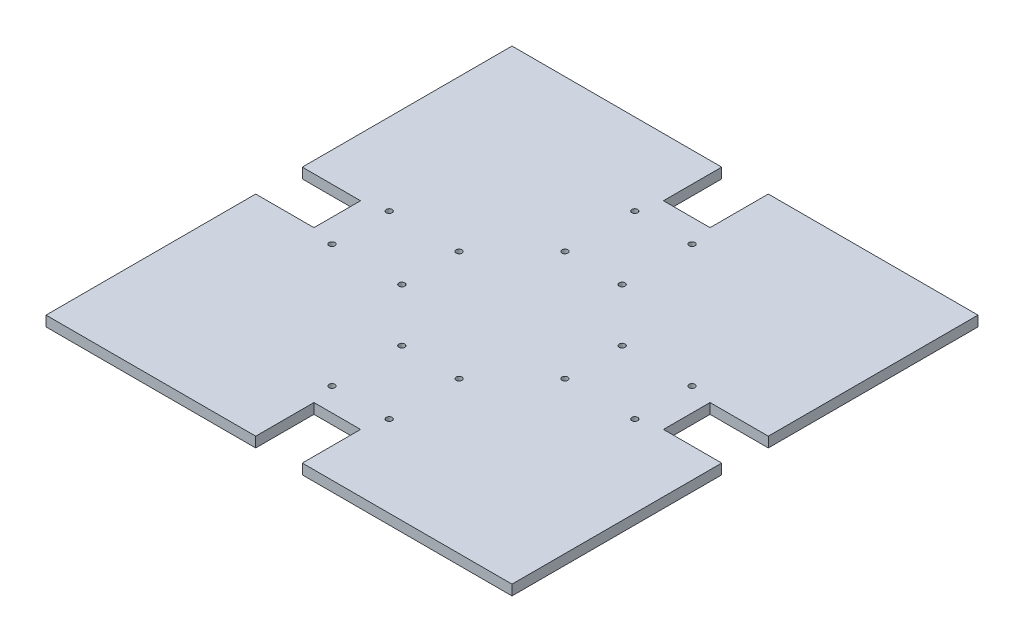
ISO-10303-21;
HEADER;
FILE_DESCRIPTION(('STEP AP214'),'2;1');
FILE_NAME('part.step','',(''),(''),'','','');
FILE_SCHEMA(('AUTOMOTIVE_DESIGN { 1 0 10303 214 1 1 1 1 }'));
ENDSEC;
DATA;
#1=APPLICATION_CONTEXT('core data for automotive mechanical design processes');
#2=APPLICATION_PROTOCOL_DEFINITION('international standard','automotive_design',2000,#1);
#3=PRODUCT_CONTEXT('',#1,'mechanical');
#4=PRODUCT('Part','Part','',(#3));
#5=PRODUCT_RELATED_PRODUCT_CATEGORY('part','',(#4));
#6=PRODUCT_DEFINITION_FORMATION('','',#4);
#7=PRODUCT_DEFINITION_CONTEXT('part definition',#1,'design');
#8=PRODUCT_DEFINITION('design','',#6,#7);
#9=PRODUCT_DEFINITION_SHAPE('','',#8);
#10=(LENGTH_UNIT() NAMED_UNIT(*) SI_UNIT(.MILLI.,.METRE.));
#11=(NAMED_UNIT(*) PLANE_ANGLE_UNIT() SI_UNIT($,.RADIAN.));
#12=(NAMED_UNIT(*) SI_UNIT($,.STERADIAN.) SOLID_ANGLE_UNIT());
#13=UNCERTAINTY_MEASURE_WITH_UNIT(LENGTH_MEASURE(1.E-05),#10,'distance_accuracy_value','');
#14=(GEOMETRIC_REPRESENTATION_CONTEXT(3) GLOBAL_UNCERTAINTY_ASSIGNED_CONTEXT((#13)) GLOBAL_UNIT_ASSIGNED_CONTEXT((#10,
#11,#12)) REPRESENTATION_CONTEXT('',''));
#15=CARTESIAN_POINT('',(0.,0.,0.));
#16=DIRECTION('',(0.,0.,1.));
#17=DIRECTION('',(1.,0.,0.));
#18=AXIS2_PLACEMENT_3D('',#15,#16,#17);
#19=CARTESIAN_POINT('',(127.,5.588,-127.));
#20=DIRECTION('',(-1.,0.,0.));
#21=DIRECTION('',(0.,0.,1.));
#22=AXIS2_PLACEMENT_3D('',#19,#20,#21);
#23=PLANE('',#22);
#24=DIRECTION('',(0.,0.,-1.));
#25=VECTOR('',#24,1.);
#26=CARTESIAN_POINT('',(127.,0.,-127.));
#27=LINE('',#26,#25);
#28=CARTESIAN_POINT('',(127.,0.,127.));
#29=VERTEX_POINT('',#28);
#30=CARTESIAN_POINT('',(127.,0.,12.7));
#31=VERTEX_POINT('',#30);
#32=EDGE_CURVE('E204',#29,#31,#27,.T.);
#33=ORIENTED_EDGE('',*,*,#32,.T.);
#34=DIRECTION('',(0.,1.,0.));
#35=VECTOR('',#34,1.);
#36=CARTESIAN_POINT('',(127.,0.,12.7));
#37=LINE('',#36,#35);
#38=CARTESIAN_POINT('',(127.,5.588,12.7));
#39=VERTEX_POINT('',#38);
#40=EDGE_CURVE('E385',#31,#39,#37,.T.);
#41=ORIENTED_EDGE('',*,*,#40,.T.);
#42=DIRECTION('',(0.,0.,-1.));
#43=VECTOR('',#42,1.);
#44=CARTESIAN_POINT('',(127.,5.588,-127.));
#45=LINE('',#44,#43);
#46=CARTESIAN_POINT('',(127.,5.588,127.));
#47=VERTEX_POINT('',#46);
#48=EDGE_CURVE('E356',#47,#39,#45,.T.);
#49=ORIENTED_EDGE('',*,*,#48,.F.);
#50=DIRECTION('',(0.,-1.,0.));
#51=VECTOR('',#50,1.);
#52=CARTESIAN_POINT('',(127.,5.588,127.));
#53=LINE('',#52,#51);
#54=EDGE_CURVE('E214',#47,#29,#53,.T.);
#55=ORIENTED_EDGE('',*,*,#54,.T.);
#56=EDGE_LOOP('',(#33,#41,#49,#55));
#57=FACE_BOUND('',#56,.T.);
#58=ADVANCED_FACE('F35',(#57),#23,.F.);
#59=CARTESIAN_POINT('',(-127.,5.588,-127.));
#60=DIRECTION('',(0.,0.,1.));
#61=DIRECTION('',(1.,0.,0.));
#62=AXIS2_PLACEMENT_3D('',#59,#60,#61);
#63=PLANE('',#62);
#64=DIRECTION('',(-1.,0.,0.));
#65=VECTOR('',#64,1.);
#66=CARTESIAN_POINT('',(-127.,0.,-127.));
#67=LINE('',#66,#65);
#68=CARTESIAN_POINT('',(127.,0.,-127.));
#69=VERTEX_POINT('',#68);
#70=CARTESIAN_POINT('',(12.7,0.,-127.));
#71=VERTEX_POINT('',#70);
#72=EDGE_CURVE('E192',#69,#71,#67,.T.);
#73=ORIENTED_EDGE('',*,*,#72,.T.);
#74=DIRECTION('',(0.,1.,0.));
#75=VECTOR('',#74,1.);
#76=CARTESIAN_POINT('',(12.7,0.,-127.));
#77=LINE('',#76,#75);
#78=CARTESIAN_POINT('',(12.7,5.588,-127.));
#79=VERTEX_POINT('',#78);
#80=EDGE_CURVE('E172',#71,#79,#77,.T.);
#81=ORIENTED_EDGE('',*,*,#80,.T.);
#82=DIRECTION('',(-1.,0.,0.));
#83=VECTOR('',#82,1.);
#84=CARTESIAN_POINT('',(-127.,5.588,-127.));
#85=LINE('',#84,#83);
#86=CARTESIAN_POINT('',(127.,5.588,-127.));
#87=VERTEX_POINT('',#86);
#88=EDGE_CURVE('E360',#87,#79,#85,.T.);
#89=ORIENTED_EDGE('',*,*,#88,.F.);
#90=DIRECTION('',(0.,-1.,0.));
#91=VECTOR('',#90,1.);
#92=CARTESIAN_POINT('',(127.,5.588,-127.));
#93=LINE('',#92,#91);
#94=EDGE_CURVE('E11',#87,#69,#93,.T.);
#95=ORIENTED_EDGE('',*,*,#94,.T.);
#96=EDGE_LOOP('',(#73,#81,#89,#95));
#97=FACE_BOUND('',#96,.T.);
#98=ADVANCED_FACE('F197',(#97),#63,.F.);
#99=CARTESIAN_POINT('',(-127.,5.588,-127.));
#100=DIRECTION('',(1.,0.,0.));
#101=DIRECTION('',(0.,0.,-1.));
#102=AXIS2_PLACEMENT_3D('',#99,#100,#101);
#103=PLANE('',#102);
#104=DIRECTION('',(0.,0.,1.));
#105=VECTOR('',#104,1.);
#106=CARTESIAN_POINT('',(-127.,5.588,-127.));
#107=LINE('',#106,#105);
#108=CARTESIAN_POINT('',(-127.,5.588,12.7));
#109=VERTEX_POINT('',#108);
#110=CARTESIAN_POINT('',(-127.,5.588,127.));
#111=VERTEX_POINT('',#110);
#112=EDGE_CURVE('E362',#109,#111,#107,.T.);
#113=ORIENTED_EDGE('',*,*,#112,.F.);
#114=DIRECTION('',(0.,1.,0.));
#115=VECTOR('',#114,1.);
#116=CARTESIAN_POINT('',(-127.,0.,12.7));
#117=LINE('',#116,#115);
#118=CARTESIAN_POINT('',(-127.,0.,12.7));
#119=VERTEX_POINT('',#118);
#120=EDGE_CURVE('E259',#119,#109,#117,.T.);
#121=ORIENTED_EDGE('',*,*,#120,.F.);
#122=DIRECTION('',(0.,0.,1.));
#123=VECTOR('',#122,1.);
#124=CARTESIAN_POINT('',(-127.,0.,-127.));
#125=LINE('',#124,#123);
#126=CARTESIAN_POINT('',(-127.,0.,127.));
#127=VERTEX_POINT('',#126);
#128=EDGE_CURVE('E199',#119,#127,#125,.T.);
#129=ORIENTED_EDGE('',*,*,#128,.T.);
#130=DIRECTION('',(0.,-1.,0.));
#131=VECTOR('',#130,1.);
#132=CARTESIAN_POINT('',(-127.,5.588,127.));
#133=LINE('',#132,#131);
#134=EDGE_CURVE('E217',#111,#127,#133,.T.);
#135=ORIENTED_EDGE('',*,*,#134,.F.);
#136=EDGE_LOOP('',(#113,#121,#129,#135));
#137=FACE_BOUND('',#136,.T.);
#138=ADVANCED_FACE('F476',(#137),#103,.F.);
#139=CARTESIAN_POINT('',(-127.,5.588,127.));
#140=DIRECTION('',(0.,0.,-1.));
#141=DIRECTION('',(-1.,0.,0.));
#142=AXIS2_PLACEMENT_3D('',#139,#140,#141);
#143=PLANE('',#142);
#144=DIRECTION('',(1.,0.,0.));
#145=VECTOR('',#144,1.);
#146=CARTESIAN_POINT('',(-127.,5.588,127.));
#147=LINE('',#146,#145);
#148=CARTESIAN_POINT('',(12.7,5.588,127.));
#149=VERTEX_POINT('',#148);
#150=EDGE_CURVE('E363',#149,#47,#147,.T.);
#151=ORIENTED_EDGE('',*,*,#150,.F.);
#152=DIRECTION('',(0.,1.,0.));
#153=VECTOR('',#152,1.);
#154=CARTESIAN_POINT('',(12.7,0.,127.));
#155=LINE('',#154,#153);
#156=CARTESIAN_POINT('',(12.7,0.,127.));
#157=VERTEX_POINT('',#156);
#158=EDGE_CURVE('E417',#157,#149,#155,.T.);
#159=ORIENTED_EDGE('',*,*,#158,.F.);
#160=DIRECTION('',(1.,0.,0.));
#161=VECTOR('',#160,1.);
#162=CARTESIAN_POINT('',(-127.,0.,127.));
#163=LINE('',#162,#161);
#164=EDGE_CURVE('E209',#157,#29,#163,.T.);
#165=ORIENTED_EDGE('',*,*,#164,.T.);
#166=ORIENTED_EDGE('',*,*,#54,.F.);
#167=EDGE_LOOP('',(#151,#159,#165,#166));
#168=FACE_BOUND('',#167,.T.);
#169=ADVANCED_FACE('F380',(#168),#143,.F.);
#170=CARTESIAN_POINT('',(127.,5.588,-12.7));
#171=VERTEX_POINT('',#170);
#172=EDGE_CURVE('E213',#171,#87,#45,.T.);
#173=ORIENTED_EDGE('',*,*,#172,.F.);
#174=DIRECTION('',(0.,1.,0.));
#175=VECTOR('',#174,1.);
#176=CARTESIAN_POINT('',(127.,0.,-12.7));
#177=LINE('',#176,#175);
#178=CARTESIAN_POINT('',(127.,0.,-12.7));
#179=VERTEX_POINT('',#178);
#180=EDGE_CURVE('E400',#179,#171,#177,.T.);
#181=ORIENTED_EDGE('',*,*,#180,.F.);
#182=EDGE_CURVE('E353',#179,#69,#27,.T.);
#183=ORIENTED_EDGE('',*,*,#182,.T.);
#184=ORIENTED_EDGE('',*,*,#94,.F.);
#185=EDGE_LOOP('',(#173,#181,#183,#184));
#186=FACE_BOUND('',#185,.T.);
#187=ADVANCED_FACE('F37',(#186),#23,.F.);
#188=CARTESIAN_POINT('',(-12.7,5.588,-127.));
#189=VERTEX_POINT('',#188);
#190=CARTESIAN_POINT('',(-127.,5.588,-127.));
#191=VERTEX_POINT('',#190);
#192=EDGE_CURVE('E359',#189,#191,#85,.T.);
#193=ORIENTED_EDGE('',*,*,#192,.F.);
#194=DIRECTION('',(0.,1.,0.));
#195=VECTOR('',#194,1.);
#196=CARTESIAN_POINT('',(-12.7,0.,-127.));
#197=LINE('',#196,#195);
#198=CARTESIAN_POINT('',(-12.7,0.,-127.));
#199=VERTEX_POINT('',#198);
#200=EDGE_CURVE('E183',#199,#189,#197,.T.);
#201=ORIENTED_EDGE('',*,*,#200,.F.);
#202=CARTESIAN_POINT('',(-127.,0.,-127.));
#203=VERTEX_POINT('',#202);
#204=EDGE_CURVE('E200',#199,#203,#67,.T.);
#205=ORIENTED_EDGE('',*,*,#204,.T.);
#206=DIRECTION('',(0.,-1.,0.));
#207=VECTOR('',#206,1.);
#208=CARTESIAN_POINT('',(-127.,5.588,-127.));
#209=LINE('',#208,#207);
#210=EDGE_CURVE('E43',#191,#203,#209,.T.);
#211=ORIENTED_EDGE('',*,*,#210,.F.);
#212=EDGE_LOOP('',(#193,#201,#205,#211));
#213=FACE_BOUND('',#212,.T.);
#214=ADVANCED_FACE('F477',(#213),#63,.F.);
#215=CARTESIAN_POINT('',(-127.,0.,-12.7));
#216=VERTEX_POINT('',#215);
#217=EDGE_CURVE('E202',#203,#216,#125,.T.);
#218=ORIENTED_EDGE('',*,*,#217,.T.);
#219=DIRECTION('',(0.,1.,0.));
#220=VECTOR('',#219,1.);
#221=CARTESIAN_POINT('',(-127.,0.,-12.7));
#222=LINE('',#221,#220);
#223=CARTESIAN_POINT('',(-127.,5.588,-12.7));
#224=VERTEX_POINT('',#223);
#225=EDGE_CURVE('E261',#216,#224,#222,.T.);
#226=ORIENTED_EDGE('',*,*,#225,.T.);
#227=EDGE_CURVE('E228',#191,#224,#107,.T.);
#228=ORIENTED_EDGE('',*,*,#227,.F.);
#229=ORIENTED_EDGE('',*,*,#210,.T.);
#230=EDGE_LOOP('',(#218,#226,#228,#229));
#231=FACE_BOUND('',#230,.T.);
#232=ADVANCED_FACE('F225',(#231),#103,.F.);
#233=CARTESIAN_POINT('',(-12.7,0.,127.));
#234=VERTEX_POINT('',#233);
#235=EDGE_CURVE('E210',#127,#234,#163,.T.);
#236=ORIENTED_EDGE('',*,*,#235,.T.);
#237=DIRECTION('',(0.,1.,0.));
#238=VECTOR('',#237,1.);
#239=CARTESIAN_POINT('',(-12.7,0.,127.));
#240=LINE('',#239,#238);
#241=CARTESIAN_POINT('',(-12.7,5.588,127.));
#242=VERTEX_POINT('',#241);
#243=EDGE_CURVE('E420',#234,#242,#240,.T.);
#244=ORIENTED_EDGE('',*,*,#243,.T.);
#245=EDGE_CURVE('E218',#111,#242,#147,.T.);
#246=ORIENTED_EDGE('',*,*,#245,.F.);
#247=ORIENTED_EDGE('',*,*,#134,.T.);
#248=EDGE_LOOP('',(#236,#244,#246,#247));
#249=FACE_BOUND('',#248,.T.);
#250=ADVANCED_FACE('F433',(#249),#143,.F.);
#251=CARTESIAN_POINT('',(0.,5.588,0.));
#252=DIRECTION('',(0.,1.,0.));
#253=DIRECTION('',(0.,0.,1.));
#254=AXIS2_PLACEMENT_3D('',#251,#252,#253);
#255=PLANE('',#254);
#256=CARTESIAN_POINT('',(82.5500000000001,5.588,-15.6));
#257=DIRECTION('',(0.,1.,0.));
#258=DIRECTION('',(0.,0.,1.));
#259=AXIS2_PLACEMENT_3D('',#256,#257,#258);
#260=CIRCLE('',#259,1.60000000000002);
#261=CARTESIAN_POINT('',(82.5500000000001,5.588,-14.));
#262=VERTEX_POINT('',#261);
#263=EDGE_CURVE('E268',#262,#262,#260,.T.);
#264=ORIENTED_EDGE('',*,*,#263,.F.);
#265=EDGE_LOOP('',(#264));
#266=FACE_BOUND('',#265,.T.);
#267=CARTESIAN_POINT('',(82.5500000000001,5.588,15.6));
#268=DIRECTION('',(0.,1.,0.));
#269=DIRECTION('',(0.,0.,1.));
#270=AXIS2_PLACEMENT_3D('',#267,#268,#269);
#271=CIRCLE('',#270,1.60000000000002);
#272=CARTESIAN_POINT('',(82.5500000000001,5.588,17.2));
#273=VERTEX_POINT('',#272);
#274=EDGE_CURVE('E274',#273,#273,#271,.T.);
#275=ORIENTED_EDGE('',*,*,#274,.F.);
#276=EDGE_LOOP('',(#275));
#277=FACE_BOUND('',#276,.T.);
#278=CARTESIAN_POINT('',(-15.6,5.588,-44.45));
#279=DIRECTION('',(0.,1.,0.));
#280=DIRECTION('',(0.,0.,1.));
#281=AXIS2_PLACEMENT_3D('',#278,#279,#280);
#282=CIRCLE('',#281,1.6);
#283=CARTESIAN_POINT('',(-15.6,5.588,-42.85));
#284=VERTEX_POINT('',#283);
#285=EDGE_CURVE('E280',#284,#284,#282,.T.);
#286=ORIENTED_EDGE('',*,*,#285,.F.);
#287=EDGE_LOOP('',(#286));
#288=FACE_BOUND('',#287,.T.);
#289=CARTESIAN_POINT('',(-15.6,5.588,-82.55));
#290=DIRECTION('',(0.,1.,0.));
#291=DIRECTION('',(0.,0.,1.));
#292=AXIS2_PLACEMENT_3D('',#289,#290,#291);
#293=CIRCLE('',#292,1.6);
#294=CARTESIAN_POINT('',(-15.6,5.588,-80.95));
#295=VERTEX_POINT('',#294);
#296=EDGE_CURVE('E286',#295,#295,#293,.T.);
#297=ORIENTED_EDGE('',*,*,#296,.F.);
#298=EDGE_LOOP('',(#297));
#299=FACE_BOUND('',#298,.T.);
#300=CARTESIAN_POINT('',(15.6,5.588,-82.55));
#301=DIRECTION('',(0.,1.,0.));
#302=DIRECTION('',(0.,0.,1.));
#303=AXIS2_PLACEMENT_3D('',#300,#301,#302);
#304=CIRCLE('',#303,1.60000000000001);
#305=CARTESIAN_POINT('',(15.6,5.588,-80.95));
#306=VERTEX_POINT('',#305);
#307=EDGE_CURVE('E292',#306,#306,#304,.T.);
#308=ORIENTED_EDGE('',*,*,#307,.F.);
#309=EDGE_LOOP('',(#308));
#310=FACE_BOUND('',#309,.T.);
#311=DIRECTION('',(0.,0.,-1.));
#312=VECTOR('',#311,1.);
#313=CARTESIAN_POINT('',(12.7,5.588,127.));
#314=LINE('',#313,#312);
#315=CARTESIAN_POINT('',(12.7,5.588,95.25));
#316=VERTEX_POINT('',#315);
#317=EDGE_CURVE('E377',#149,#316,#314,.T.);
#318=ORIENTED_EDGE('',*,*,#317,.F.);
#319=ORIENTED_EDGE('',*,*,#150,.T.);
#320=ORIENTED_EDGE('',*,*,#48,.T.);
#321=DIRECTION('',(1.,0.,0.));
#322=VECTOR('',#321,1.);
#323=CARTESIAN_POINT('',(95.2500000000001,5.588,12.7));
#324=LINE('',#323,#322);
#325=CARTESIAN_POINT('',(95.2500000000001,5.588,12.7));
#326=VERTEX_POINT('',#325);
#327=EDGE_CURVE('E396',#326,#39,#324,.T.);
#328=ORIENTED_EDGE('',*,*,#327,.F.);
#329=DIRECTION('',(0.,0.,1.));
#330=VECTOR('',#329,1.);
#331=CARTESIAN_POINT('',(95.2500000000001,5.588,12.7));
#332=LINE('',#331,#330);
#333=CARTESIAN_POINT('',(95.2500000000001,5.588,-12.7));
#334=VERTEX_POINT('',#333);
#335=EDGE_CURVE('E491',#334,#326,#332,.T.);
#336=ORIENTED_EDGE('',*,*,#335,.F.);
#337=DIRECTION('',(-1.,0.,0.));
#338=VECTOR('',#337,1.);
#339=CARTESIAN_POINT('',(95.2500000000001,5.588,-12.7));
#340=LINE('',#339,#338);
#341=EDGE_CURVE('E419',#171,#334,#340,.T.);
#342=ORIENTED_EDGE('',*,*,#341,.F.);
#343=ORIENTED_EDGE('',*,*,#172,.T.);
#344=ORIENTED_EDGE('',*,*,#88,.T.);
#345=DIRECTION('',(0.,0.,-1.));
#346=VECTOR('',#345,1.);
#347=CARTESIAN_POINT('',(12.7,5.588,-95.25));
#348=LINE('',#347,#346);
#349=CARTESIAN_POINT('',(12.7,5.588,-95.25));
#350=VERTEX_POINT('',#349);
#351=EDGE_CURVE('E178',#350,#79,#348,.T.);
#352=ORIENTED_EDGE('',*,*,#351,.F.);
#353=DIRECTION('',(1.,0.,0.));
#354=VECTOR('',#353,1.);
#355=CARTESIAN_POINT('',(-12.7,5.588,-95.25));
#356=LINE('',#355,#354);
#357=CARTESIAN_POINT('',(-12.7,5.588,-95.25));
#358=VERTEX_POINT('',#357);
#359=EDGE_CURVE('E195',#358,#350,#356,.T.);
#360=ORIENTED_EDGE('',*,*,#359,.F.);
#361=DIRECTION('',(0.,0.,1.));
#362=VECTOR('',#361,1.);
#363=CARTESIAN_POINT('',(-12.7,5.588,-95.25));
#364=LINE('',#363,#362);
#365=EDGE_CURVE('E391',#189,#358,#364,.T.);
#366=ORIENTED_EDGE('',*,*,#365,.F.);
#367=ORIENTED_EDGE('',*,*,#192,.T.);
#368=ORIENTED_EDGE('',*,*,#227,.T.);
#369=DIRECTION('',(-1.,0.,0.));
#370=VECTOR('',#369,1.);
#371=CARTESIAN_POINT('',(-127.,5.588,-12.7));
#372=LINE('',#371,#370);
#373=CARTESIAN_POINT('',(-95.25,5.588,-12.7));
#374=VERTEX_POINT('',#373);
#375=EDGE_CURVE('E251',#374,#224,#372,.T.);
#376=ORIENTED_EDGE('',*,*,#375,.F.);
#377=DIRECTION('',(0.,0.,-1.));
#378=VECTOR('',#377,1.);
#379=CARTESIAN_POINT('',(-95.25,5.588,12.7));
#380=LINE('',#379,#378);
#381=CARTESIAN_POINT('',(-95.25,5.588,12.7));
#382=VERTEX_POINT('',#381);
#383=EDGE_CURVE('E248',#382,#374,#380,.T.);
#384=ORIENTED_EDGE('',*,*,#383,.F.);
#385=DIRECTION('',(1.,0.,0.));
#386=VECTOR('',#385,1.);
#387=CARTESIAN_POINT('',(-127.,5.588,12.7));
#388=LINE('',#387,#386);
#389=EDGE_CURVE('E244',#109,#382,#388,.T.);
#390=ORIENTED_EDGE('',*,*,#389,.F.);
#391=ORIENTED_EDGE('',*,*,#112,.T.);
#392=ORIENTED_EDGE('',*,*,#245,.T.);
#393=DIRECTION('',(0.,0.,1.));
#394=VECTOR('',#393,1.);
#395=CARTESIAN_POINT('',(-12.7,5.588,127.));
#396=LINE('',#395,#394);
#397=CARTESIAN_POINT('',(-12.7,5.588,95.25));
#398=VERTEX_POINT('',#397);
#399=EDGE_CURVE('E407',#398,#242,#396,.T.);
#400=ORIENTED_EDGE('',*,*,#399,.F.);
#401=DIRECTION('',(-1.,0.,0.));
#402=VECTOR('',#401,1.);
#403=CARTESIAN_POINT('',(-12.7,5.588,95.25));
#404=LINE('',#403,#402);
#405=EDGE_CURVE('E413',#316,#398,#404,.T.);
#406=ORIENTED_EDGE('',*,*,#405,.F.);
#407=EDGE_LOOP('',(#318,#319,#320,#328,#336,#342,#343,#344,#352,#360,#366,#367,#368,#376,#384,
#390,#391,#392,#400,#406));
#408=FACE_BOUND('',#407,.T.);
#409=CARTESIAN_POINT('',(15.6,5.588,-44.45));
#410=DIRECTION('',(0.,1.,0.));
#411=DIRECTION('',(0.,0.,1.));
#412=AXIS2_PLACEMENT_3D('',#409,#410,#411);
#413=CIRCLE('',#412,1.60000000000001);
#414=CARTESIAN_POINT('',(15.6,5.588,-42.85));
#415=VERTEX_POINT('',#414);
#416=EDGE_CURVE('E258',#415,#415,#413,.T.);
#417=ORIENTED_EDGE('',*,*,#416,.F.);
#418=EDGE_LOOP('',(#417));
#419=FACE_BOUND('',#418,.T.);
#420=CARTESIAN_POINT('',(-44.45,5.588,15.6));
#421=DIRECTION('',(0.,1.,0.));
#422=DIRECTION('',(0.,0.,1.));
#423=AXIS2_PLACEMENT_3D('',#420,#421,#422);
#424=CIRCLE('',#423,1.6);
#425=CARTESIAN_POINT('',(-44.45,5.588,17.2));
#426=VERTEX_POINT('',#425);
#427=EDGE_CURVE('E330',#426,#426,#424,.T.);
#428=ORIENTED_EDGE('',*,*,#427,.F.);
#429=EDGE_LOOP('',(#428));
#430=FACE_BOUND('',#429,.T.);
#431=CARTESIAN_POINT('',(-82.55,5.588,15.6));
#432=DIRECTION('',(0.,1.,0.));
#433=DIRECTION('',(0.,0.,1.));
#434=AXIS2_PLACEMENT_3D('',#431,#432,#433);
#435=CIRCLE('',#434,1.59999999999999);
#436=CARTESIAN_POINT('',(-82.55,5.588,17.2));
#437=VERTEX_POINT('',#436);
#438=EDGE_CURVE('E336',#437,#437,#435,.T.);
#439=ORIENTED_EDGE('',*,*,#438,.F.);
#440=EDGE_LOOP('',(#439));
#441=FACE_BOUND('',#440,.T.);
#442=CARTESIAN_POINT('',(-15.6,5.588,44.45));
#443=DIRECTION('',(0.,1.,0.));
#444=DIRECTION('',(0.,0.,1.));
#445=AXIS2_PLACEMENT_3D('',#442,#443,#444);
#446=CIRCLE('',#445,1.60000000000001);
#447=CARTESIAN_POINT('',(-15.6,5.588,46.05));
#448=VERTEX_POINT('',#447);
#449=EDGE_CURVE('E342',#448,#448,#446,.T.);
#450=ORIENTED_EDGE('',*,*,#449,.F.);
#451=EDGE_LOOP('',(#450));
#452=FACE_BOUND('',#451,.T.);
#453=CARTESIAN_POINT('',(15.6,5.588,44.45));
#454=DIRECTION('',(0.,1.,0.));
#455=DIRECTION('',(0.,0.,1.));
#456=AXIS2_PLACEMENT_3D('',#453,#454,#455);
#457=CIRCLE('',#456,1.60000000000002);
#458=CARTESIAN_POINT('',(15.6,5.588,46.05));
#459=VERTEX_POINT('',#458);
#460=EDGE_CURVE('E299',#459,#459,#457,.T.);
#461=ORIENTED_EDGE('',*,*,#460,.F.);
#462=EDGE_LOOP('',(#461));
#463=FACE_BOUND('',#462,.T.);
#464=CARTESIAN_POINT('',(-82.55,5.588,-15.6));
#465=DIRECTION('',(0.,1.,0.));
#466=DIRECTION('',(0.,0.,1.));
#467=AXIS2_PLACEMENT_3D('',#464,#465,#466);
#468=CIRCLE('',#467,1.59999999999999);
#469=CARTESIAN_POINT('',(-82.55,5.588,-14.));
#470=VERTEX_POINT('',#469);
#471=EDGE_CURVE('E300',#470,#470,#468,.T.);
#472=ORIENTED_EDGE('',*,*,#471,.F.);
#473=EDGE_LOOP('',(#472));
#474=FACE_BOUND('',#473,.T.);
#475=CARTESIAN_POINT('',(-15.6,5.588,82.55));
#476=DIRECTION('',(0.,1.,0.));
#477=DIRECTION('',(0.,0.,1.));
#478=AXIS2_PLACEMENT_3D('',#475,#476,#477);
#479=CIRCLE('',#478,1.6);
#480=CARTESIAN_POINT('',(-15.6,5.588,84.15));
#481=VERTEX_POINT('',#480);
#482=EDGE_CURVE('E306',#481,#481,#479,.T.);
#483=ORIENTED_EDGE('',*,*,#482,.F.);
#484=EDGE_LOOP('',(#483));
#485=FACE_BOUND('',#484,.T.);
#486=CARTESIAN_POINT('',(15.6,5.588,82.55));
#487=DIRECTION('',(0.,1.,0.));
#488=DIRECTION('',(0.,0.,1.));
#489=AXIS2_PLACEMENT_3D('',#486,#487,#488);
#490=CIRCLE('',#489,1.60000000000001);
#491=CARTESIAN_POINT('',(15.6,5.588,84.15));
#492=VERTEX_POINT('',#491);
#493=EDGE_CURVE('E312',#492,#492,#490,.T.);
#494=ORIENTED_EDGE('',*,*,#493,.F.);
#495=EDGE_LOOP('',(#494));
#496=FACE_BOUND('',#495,.T.);
#497=CARTESIAN_POINT('',(44.4500000000001,5.588,15.6));
#498=DIRECTION('',(0.,1.,0.));
#499=DIRECTION('',(0.,0.,1.));
#500=AXIS2_PLACEMENT_3D('',#497,#498,#499);
#501=CIRCLE('',#500,1.6);
#502=CARTESIAN_POINT('',(44.4500000000001,5.588,17.2));
#503=VERTEX_POINT('',#502);
#504=EDGE_CURVE('E318',#503,#503,#501,.T.);
#505=ORIENTED_EDGE('',*,*,#504,.F.);
#506=EDGE_LOOP('',(#505));
#507=FACE_BOUND('',#506,.T.);
#508=CARTESIAN_POINT('',(44.4500000000001,5.588,-15.6));
#509=DIRECTION('',(0.,1.,0.));
#510=DIRECTION('',(0.,0.,1.));
#511=AXIS2_PLACEMENT_3D('',#508,#509,#510);
#512=CIRCLE('',#511,1.6);
#513=CARTESIAN_POINT('',(44.4500000000001,5.588,-14.));
#514=VERTEX_POINT('',#513);
#515=EDGE_CURVE('E267',#514,#514,#512,.T.);
#516=ORIENTED_EDGE('',*,*,#515,.F.);
#517=EDGE_LOOP('',(#516));
#518=FACE_BOUND('',#517,.T.);
#519=CARTESIAN_POINT('',(-44.45,5.588,-15.6));
#520=DIRECTION('',(0.,1.,0.));
#521=DIRECTION('',(0.,0.,1.));
#522=AXIS2_PLACEMENT_3D('',#519,#520,#521);
#523=CIRCLE('',#522,1.60000000000001);
#524=CARTESIAN_POINT('',(-44.45,5.588,-14.));
#525=VERTEX_POINT('',#524);
#526=EDGE_CURVE('E329',#525,#525,#523,.T.);
#527=ORIENTED_EDGE('',*,*,#526,.F.);
#528=EDGE_LOOP('',(#527));
#529=FACE_BOUND('',#528,.T.);
#530=ADVANCED_FACE('F371',(#266,#277,#288,#299,#310,#408,#419,#430,#441,#452,#463,#474,#485,
#496,#507,#518,#529),#255,.T.);
#531=CARTESIAN_POINT('',(0.,0.,0.));
#532=DIRECTION('',(0.,1.,0.));
#533=DIRECTION('',(0.,0.,1.));
#534=AXIS2_PLACEMENT_3D('',#531,#532,#533);
#535=PLANE('',#534);
#536=CARTESIAN_POINT('',(82.5500000000001,0.,-15.6));
#537=DIRECTION('',(0.,1.,0.));
#538=DIRECTION('',(0.,0.,1.));
#539=AXIS2_PLACEMENT_3D('',#536,#537,#538);
#540=CIRCLE('',#539,1.60000000000002);
#541=CARTESIAN_POINT('',(82.5500000000001,0.,-14.));
#542=VERTEX_POINT('',#541);
#543=EDGE_CURVE('E264',#542,#542,#540,.T.);
#544=ORIENTED_EDGE('',*,*,#543,.T.);
#545=EDGE_LOOP('',(#544));
#546=FACE_BOUND('',#545,.T.);
#547=CARTESIAN_POINT('',(82.5500000000001,0.,15.6));
#548=DIRECTION('',(0.,1.,0.));
#549=DIRECTION('',(0.,0.,1.));
#550=AXIS2_PLACEMENT_3D('',#547,#548,#549);
#551=CIRCLE('',#550,1.60000000000002);
#552=CARTESIAN_POINT('',(82.5500000000001,0.,17.2));
#553=VERTEX_POINT('',#552);
#554=EDGE_CURVE('E271',#553,#553,#551,.T.);
#555=ORIENTED_EDGE('',*,*,#554,.T.);
#556=EDGE_LOOP('',(#555));
#557=FACE_BOUND('',#556,.T.);
#558=CARTESIAN_POINT('',(-15.6,0.,-44.45));
#559=DIRECTION('',(0.,1.,0.));
#560=DIRECTION('',(0.,0.,1.));
#561=AXIS2_PLACEMENT_3D('',#558,#559,#560);
#562=CIRCLE('',#561,1.6);
#563=CARTESIAN_POINT('',(-15.6,0.,-42.85));
#564=VERTEX_POINT('',#563);
#565=EDGE_CURVE('E277',#564,#564,#562,.T.);
#566=ORIENTED_EDGE('',*,*,#565,.T.);
#567=EDGE_LOOP('',(#566));
#568=FACE_BOUND('',#567,.T.);
#569=CARTESIAN_POINT('',(-15.6,0.,-82.55));
#570=DIRECTION('',(0.,1.,0.));
#571=DIRECTION('',(0.,0.,1.));
#572=AXIS2_PLACEMENT_3D('',#569,#570,#571);
#573=CIRCLE('',#572,1.6);
#574=CARTESIAN_POINT('',(-15.6,0.,-80.95));
#575=VERTEX_POINT('',#574);
#576=EDGE_CURVE('E283',#575,#575,#573,.T.);
#577=ORIENTED_EDGE('',*,*,#576,.T.);
#578=EDGE_LOOP('',(#577));
#579=FACE_BOUND('',#578,.T.);
#580=CARTESIAN_POINT('',(15.6,0.,-82.55));
#581=DIRECTION('',(0.,1.,0.));
#582=DIRECTION('',(0.,0.,1.));
#583=AXIS2_PLACEMENT_3D('',#580,#581,#582);
#584=CIRCLE('',#583,1.60000000000001);
#585=CARTESIAN_POINT('',(15.6,0.,-80.95));
#586=VERTEX_POINT('',#585);
#587=EDGE_CURVE('E289',#586,#586,#584,.T.);
#588=ORIENTED_EDGE('',*,*,#587,.T.);
#589=EDGE_LOOP('',(#588));
#590=FACE_BOUND('',#589,.T.);
#591=ORIENTED_EDGE('',*,*,#164,.F.);
#592=DIRECTION('',(0.,0.,-1.));
#593=VECTOR('',#592,1.);
#594=CARTESIAN_POINT('',(12.7,0.,127.));
#595=LINE('',#594,#593);
#596=CARTESIAN_POINT('',(12.7,0.,95.25));
#597=VERTEX_POINT('',#596);
#598=EDGE_CURVE('E403',#157,#597,#595,.T.);
#599=ORIENTED_EDGE('',*,*,#598,.T.);
#600=DIRECTION('',(-1.,0.,0.));
#601=VECTOR('',#600,1.);
#602=CARTESIAN_POINT('',(-12.7,0.,95.25));
#603=LINE('',#602,#601);
#604=CARTESIAN_POINT('',(-12.7,0.,95.25));
#605=VERTEX_POINT('',#604);
#606=EDGE_CURVE('E406',#597,#605,#603,.T.);
#607=ORIENTED_EDGE('',*,*,#606,.T.);
#608=DIRECTION('',(0.,0.,1.));
#609=VECTOR('',#608,1.);
#610=CARTESIAN_POINT('',(-12.7,0.,127.));
#611=LINE('',#610,#609);
#612=EDGE_CURVE('E50',#605,#234,#611,.T.);
#613=ORIENTED_EDGE('',*,*,#612,.T.);
#614=ORIENTED_EDGE('',*,*,#235,.F.);
#615=ORIENTED_EDGE('',*,*,#128,.F.);
#616=DIRECTION('',(1.,0.,0.));
#617=VECTOR('',#616,1.);
#618=CARTESIAN_POINT('',(-127.,0.,12.7));
#619=LINE('',#618,#617);
#620=CARTESIAN_POINT('',(-95.25,0.,12.7));
#621=VERTEX_POINT('',#620);
#622=EDGE_CURVE('E240',#119,#621,#619,.T.);
#623=ORIENTED_EDGE('',*,*,#622,.T.);
#624=DIRECTION('',(0.,0.,-1.));
#625=VECTOR('',#624,1.);
#626=CARTESIAN_POINT('',(-95.25,0.,12.7));
#627=LINE('',#626,#625);
#628=CARTESIAN_POINT('',(-95.25,0.,-12.7));
#629=VERTEX_POINT('',#628);
#630=EDGE_CURVE('E238',#621,#629,#627,.T.);
#631=ORIENTED_EDGE('',*,*,#630,.T.);
#632=DIRECTION('',(-1.,0.,0.));
#633=VECTOR('',#632,1.);
#634=CARTESIAN_POINT('',(-127.,0.,-12.7));
#635=LINE('',#634,#633);
#636=EDGE_CURVE('E235',#629,#216,#635,.T.);
#637=ORIENTED_EDGE('',*,*,#636,.T.);
#638=ORIENTED_EDGE('',*,*,#217,.F.);
#639=ORIENTED_EDGE('',*,*,#204,.F.);
#640=DIRECTION('',(0.,0.,1.));
#641=VECTOR('',#640,1.);
#642=CARTESIAN_POINT('',(-12.7,0.,-95.25));
#643=LINE('',#642,#641);
#644=CARTESIAN_POINT('',(-12.7,0.,-95.25));
#645=VERTEX_POINT('',#644);
#646=EDGE_CURVE('E194',#199,#645,#643,.T.);
#647=ORIENTED_EDGE('',*,*,#646,.T.);
#648=DIRECTION('',(1.,0.,0.));
#649=VECTOR('',#648,1.);
#650=CARTESIAN_POINT('',(-12.7,0.,-95.25));
#651=LINE('',#650,#649);
#652=CARTESIAN_POINT('',(12.7,0.,-95.25));
#653=VERTEX_POINT('',#652);
#654=EDGE_CURVE('E184',#645,#653,#651,.T.);
#655=ORIENTED_EDGE('',*,*,#654,.T.);
#656=DIRECTION('',(0.,0.,-1.));
#657=VECTOR('',#656,1.);
#658=CARTESIAN_POINT('',(12.7,0.,-95.25));
#659=LINE('',#658,#657);
#660=EDGE_CURVE('E175',#653,#71,#659,.T.);
#661=ORIENTED_EDGE('',*,*,#660,.T.);
#662=ORIENTED_EDGE('',*,*,#72,.F.);
#663=ORIENTED_EDGE('',*,*,#182,.F.);
#664=DIRECTION('',(-1.,0.,0.));
#665=VECTOR('',#664,1.);
#666=CARTESIAN_POINT('',(95.2500000000001,0.,-12.7));
#667=LINE('',#666,#665);
#668=CARTESIAN_POINT('',(95.2500000000001,0.,-12.7));
#669=VERTEX_POINT('',#668);
#670=EDGE_CURVE('E497',#179,#669,#667,.T.);
#671=ORIENTED_EDGE('',*,*,#670,.T.);
#672=DIRECTION('',(0.,0.,1.));
#673=VECTOR('',#672,1.);
#674=CARTESIAN_POINT('',(95.2500000000001,0.,12.7));
#675=LINE('',#674,#673);
#676=CARTESIAN_POINT('',(95.2500000000001,0.,12.7));
#677=VERTEX_POINT('',#676);
#678=EDGE_CURVE('E58',#669,#677,#675,.T.);
#679=ORIENTED_EDGE('',*,*,#678,.T.);
#680=DIRECTION('',(1.,0.,0.));
#681=VECTOR('',#680,1.);
#682=CARTESIAN_POINT('',(95.2500000000001,0.,12.7));
#683=LINE('',#682,#681);
#684=EDGE_CURVE('E402',#677,#31,#683,.T.);
#685=ORIENTED_EDGE('',*,*,#684,.T.);
#686=ORIENTED_EDGE('',*,*,#32,.F.);
#687=EDGE_LOOP('',(#591,#599,#607,#613,#614,#615,#623,#631,#637,#638,#639,#647,#655,#661,#662,
#663,#671,#679,#685,#686));
#688=FACE_BOUND('',#687,.T.);
#689=CARTESIAN_POINT('',(15.6,0.,-44.45));
#690=DIRECTION('',(0.,1.,0.));
#691=DIRECTION('',(0.,0.,1.));
#692=AXIS2_PLACEMENT_3D('',#689,#690,#691);
#693=CIRCLE('',#692,1.60000000000001);
#694=CARTESIAN_POINT('',(15.6,0.,-42.85));
#695=VERTEX_POINT('',#694);
#696=EDGE_CURVE('E295',#695,#695,#693,.T.);
#697=ORIENTED_EDGE('',*,*,#696,.T.);
#698=EDGE_LOOP('',(#697));
#699=FACE_BOUND('',#698,.T.);
#700=CARTESIAN_POINT('',(-44.45,0.,15.6));
#701=DIRECTION('',(0.,1.,0.));
#702=DIRECTION('',(0.,0.,1.));
#703=AXIS2_PLACEMENT_3D('',#700,#701,#702);
#704=CIRCLE('',#703,1.6);
#705=CARTESIAN_POINT('',(-44.45,0.,17.2));
#706=VERTEX_POINT('',#705);
#707=EDGE_CURVE('E326',#706,#706,#704,.T.);
#708=ORIENTED_EDGE('',*,*,#707,.T.);
#709=EDGE_LOOP('',(#708));
#710=FACE_BOUND('',#709,.T.);
#711=CARTESIAN_POINT('',(-82.55,0.,15.6));
#712=DIRECTION('',(0.,1.,0.));
#713=DIRECTION('',(0.,0.,1.));
#714=AXIS2_PLACEMENT_3D('',#711,#712,#713);
#715=CIRCLE('',#714,1.59999999999999);
#716=CARTESIAN_POINT('',(-82.55,0.,17.2));
#717=VERTEX_POINT('',#716);
#718=EDGE_CURVE('E333',#717,#717,#715,.T.);
#719=ORIENTED_EDGE('',*,*,#718,.T.);
#720=EDGE_LOOP('',(#719));
#721=FACE_BOUND('',#720,.T.);
#722=CARTESIAN_POINT('',(-15.6,0.,44.45));
#723=DIRECTION('',(0.,1.,0.));
#724=DIRECTION('',(0.,0.,1.));
#725=AXIS2_PLACEMENT_3D('',#722,#723,#724);
#726=CIRCLE('',#725,1.60000000000001);
#727=CARTESIAN_POINT('',(-15.6,0.,46.05));
#728=VERTEX_POINT('',#727);
#729=EDGE_CURVE('E339',#728,#728,#726,.T.);
#730=ORIENTED_EDGE('',*,*,#729,.T.);
#731=EDGE_LOOP('',(#730));
#732=FACE_BOUND('',#731,.T.);
#733=CARTESIAN_POINT('',(15.6,0.,44.45));
#734=DIRECTION('',(0.,1.,0.));
#735=DIRECTION('',(0.,0.,1.));
#736=AXIS2_PLACEMENT_3D('',#733,#734,#735);
#737=CIRCLE('',#736,1.60000000000002);
#738=CARTESIAN_POINT('',(15.6,0.,46.05));
#739=VERTEX_POINT('',#738);
#740=EDGE_CURVE('E345',#739,#739,#737,.T.);
#741=ORIENTED_EDGE('',*,*,#740,.T.);
#742=EDGE_LOOP('',(#741));
#743=FACE_BOUND('',#742,.T.);
#744=CARTESIAN_POINT('',(-82.55,0.,-15.6));
#745=DIRECTION('',(0.,1.,0.));
#746=DIRECTION('',(0.,0.,1.));
#747=AXIS2_PLACEMENT_3D('',#744,#745,#746);
#748=CIRCLE('',#747,1.59999999999999);
#749=CARTESIAN_POINT('',(-82.55,0.,-14.));
#750=VERTEX_POINT('',#749);
#751=EDGE_CURVE('E296',#750,#750,#748,.T.);
#752=ORIENTED_EDGE('',*,*,#751,.T.);
#753=EDGE_LOOP('',(#752));
#754=FACE_BOUND('',#753,.T.);
#755=CARTESIAN_POINT('',(-15.6,0.,82.55));
#756=DIRECTION('',(0.,1.,0.));
#757=DIRECTION('',(0.,0.,1.));
#758=AXIS2_PLACEMENT_3D('',#755,#756,#757);
#759=CIRCLE('',#758,1.6);
#760=CARTESIAN_POINT('',(-15.6,0.,84.15));
#761=VERTEX_POINT('',#760);
#762=EDGE_CURVE('E303',#761,#761,#759,.T.);
#763=ORIENTED_EDGE('',*,*,#762,.T.);
#764=EDGE_LOOP('',(#763));
#765=FACE_BOUND('',#764,.T.);
#766=CARTESIAN_POINT('',(15.6,0.,82.55));
#767=DIRECTION('',(0.,1.,0.));
#768=DIRECTION('',(0.,0.,1.));
#769=AXIS2_PLACEMENT_3D('',#766,#767,#768);
#770=CIRCLE('',#769,1.60000000000001);
#771=CARTESIAN_POINT('',(15.6,0.,84.15));
#772=VERTEX_POINT('',#771);
#773=EDGE_CURVE('E309',#772,#772,#770,.T.);
#774=ORIENTED_EDGE('',*,*,#773,.T.);
#775=EDGE_LOOP('',(#774));
#776=FACE_BOUND('',#775,.T.);
#777=CARTESIAN_POINT('',(44.4500000000001,0.,15.6));
#778=DIRECTION('',(0.,1.,0.));
#779=DIRECTION('',(0.,0.,1.));
#780=AXIS2_PLACEMENT_3D('',#777,#778,#779);
#781=CIRCLE('',#780,1.6);
#782=CARTESIAN_POINT('',(44.4500000000001,0.,17.2));
#783=VERTEX_POINT('',#782);
#784=EDGE_CURVE('E315',#783,#783,#781,.T.);
#785=ORIENTED_EDGE('',*,*,#784,.T.);
#786=EDGE_LOOP('',(#785));
#787=FACE_BOUND('',#786,.T.);
#788=CARTESIAN_POINT('',(44.4500000000001,0.,-15.6));
#789=DIRECTION('',(0.,1.,0.));
#790=DIRECTION('',(0.,0.,1.));
#791=AXIS2_PLACEMENT_3D('',#788,#789,#790);
#792=CIRCLE('',#791,1.6);
#793=CARTESIAN_POINT('',(44.4500000000001,0.,-14.));
#794=VERTEX_POINT('',#793);
#795=EDGE_CURVE('E321',#794,#794,#792,.T.);
#796=ORIENTED_EDGE('',*,*,#795,.T.);
#797=EDGE_LOOP('',(#796));
#798=FACE_BOUND('',#797,.T.);
#799=CARTESIAN_POINT('',(-44.45,0.,-15.6));
#800=DIRECTION('',(0.,1.,0.));
#801=DIRECTION('',(0.,0.,1.));
#802=AXIS2_PLACEMENT_3D('',#799,#800,#801);
#803=CIRCLE('',#802,1.60000000000001);
#804=CARTESIAN_POINT('',(-44.45,0.,-14.));
#805=VERTEX_POINT('',#804);
#806=EDGE_CURVE('E350',#805,#805,#803,.T.);
#807=ORIENTED_EDGE('',*,*,#806,.T.);
#808=EDGE_LOOP('',(#807));
#809=FACE_BOUND('',#808,.T.);
#810=ADVANCED_FACE('F189',(#546,#557,#568,#579,#590,#688,#699,#710,#721,#732,#743,#754,#765,
#776,#787,#798,#809),#535,.F.);
#811=CARTESIAN_POINT('',(-44.45,0.,-15.6));
#812=DIRECTION('',(0.,1.,0.));
#813=DIRECTION('',(0.,0.,1.));
#814=AXIS2_PLACEMENT_3D('',#811,#812,#813);
#815=CYLINDRICAL_SURFACE('',#814,1.60000000000001);
#816=ORIENTED_EDGE('',*,*,#806,.F.);
#817=EDGE_LOOP('',(#816));
#818=FACE_BOUND('',#817,.T.);
#819=ORIENTED_EDGE('',*,*,#526,.T.);
#820=EDGE_LOOP('',(#819));
#821=FACE_BOUND('',#820,.T.);
#822=ADVANCED_FACE('F456',(#818,#821),#815,.F.);
#823=CARTESIAN_POINT('',(44.4500000000001,0.,-15.6));
#824=DIRECTION('',(0.,1.,0.));
#825=DIRECTION('',(0.,0.,1.));
#826=AXIS2_PLACEMENT_3D('',#823,#824,#825);
#827=CYLINDRICAL_SURFACE('',#826,1.6);
#828=ORIENTED_EDGE('',*,*,#795,.F.);
#829=EDGE_LOOP('',(#828));
#830=FACE_BOUND('',#829,.T.);
#831=ORIENTED_EDGE('',*,*,#515,.T.);
#832=EDGE_LOOP('',(#831));
#833=FACE_BOUND('',#832,.T.);
#834=ADVANCED_FACE('F458',(#830,#833),#827,.F.);
#835=CARTESIAN_POINT('',(44.4500000000001,0.,15.6));
#836=DIRECTION('',(0.,1.,0.));
#837=DIRECTION('',(0.,0.,1.));
#838=AXIS2_PLACEMENT_3D('',#835,#836,#837);
#839=CYLINDRICAL_SURFACE('',#838,1.6);
#840=ORIENTED_EDGE('',*,*,#784,.F.);
#841=EDGE_LOOP('',(#840));
#842=FACE_BOUND('',#841,.T.);
#843=ORIENTED_EDGE('',*,*,#504,.T.);
#844=EDGE_LOOP('',(#843));
#845=FACE_BOUND('',#844,.T.);
#846=ADVANCED_FACE('F465',(#842,#845),#839,.F.);
#847=CARTESIAN_POINT('',(15.6,0.,82.55));
#848=DIRECTION('',(0.,1.,0.));
#849=DIRECTION('',(0.,0.,1.));
#850=AXIS2_PLACEMENT_3D('',#847,#848,#849);
#851=CYLINDRICAL_SURFACE('',#850,1.60000000000001);
#852=ORIENTED_EDGE('',*,*,#773,.F.);
#853=EDGE_LOOP('',(#852));
#854=FACE_BOUND('',#853,.T.);
#855=ORIENTED_EDGE('',*,*,#493,.T.);
#856=EDGE_LOOP('',(#855));
#857=FACE_BOUND('',#856,.T.);
#858=ADVANCED_FACE('F590',(#854,#857),#851,.F.);
#859=CARTESIAN_POINT('',(-15.6,0.,82.55));
#860=DIRECTION('',(0.,1.,0.));
#861=DIRECTION('',(0.,0.,1.));
#862=AXIS2_PLACEMENT_3D('',#859,#860,#861);
#863=CYLINDRICAL_SURFACE('',#862,1.6);
#864=ORIENTED_EDGE('',*,*,#762,.F.);
#865=EDGE_LOOP('',(#864));
#866=FACE_BOUND('',#865,.T.);
#867=ORIENTED_EDGE('',*,*,#482,.T.);
#868=EDGE_LOOP('',(#867));
#869=FACE_BOUND('',#868,.T.);
#870=ADVANCED_FACE('F586',(#866,#869),#863,.F.);
#871=CARTESIAN_POINT('',(-82.55,0.,-15.6));
#872=DIRECTION('',(0.,1.,0.));
#873=DIRECTION('',(0.,0.,1.));
#874=AXIS2_PLACEMENT_3D('',#871,#872,#873);
#875=CYLINDRICAL_SURFACE('',#874,1.59999999999999);
#876=ORIENTED_EDGE('',*,*,#751,.F.);
#877=EDGE_LOOP('',(#876));
#878=FACE_BOUND('',#877,.T.);
#879=ORIENTED_EDGE('',*,*,#471,.T.);
#880=EDGE_LOOP('',(#879));
#881=FACE_BOUND('',#880,.T.);
#882=ADVANCED_FACE('F582',(#878,#881),#875,.F.);
#883=CARTESIAN_POINT('',(15.6,0.,44.45));
#884=DIRECTION('',(0.,1.,0.));
#885=DIRECTION('',(0.,0.,1.));
#886=AXIS2_PLACEMENT_3D('',#883,#884,#885);
#887=CYLINDRICAL_SURFACE('',#886,1.60000000000002);
#888=ORIENTED_EDGE('',*,*,#740,.F.);
#889=EDGE_LOOP('',(#888));
#890=FACE_BOUND('',#889,.T.);
#891=ORIENTED_EDGE('',*,*,#460,.T.);
#892=EDGE_LOOP('',(#891));
#893=FACE_BOUND('',#892,.T.);
#894=ADVANCED_FACE('F585',(#890,#893),#887,.F.);
#895=CARTESIAN_POINT('',(-15.6,0.,44.45));
#896=DIRECTION('',(0.,1.,0.));
#897=DIRECTION('',(0.,0.,1.));
#898=AXIS2_PLACEMENT_3D('',#895,#896,#897);
#899=CYLINDRICAL_SURFACE('',#898,1.60000000000001);
#900=ORIENTED_EDGE('',*,*,#729,.F.);
#901=EDGE_LOOP('',(#900));
#902=FACE_BOUND('',#901,.T.);
#903=ORIENTED_EDGE('',*,*,#449,.T.);
#904=EDGE_LOOP('',(#903));
#905=FACE_BOUND('',#904,.T.);
#906=ADVANCED_FACE('F604',(#902,#905),#899,.F.);
#907=CARTESIAN_POINT('',(-82.55,0.,15.6));
#908=DIRECTION('',(0.,1.,0.));
#909=DIRECTION('',(0.,0.,1.));
#910=AXIS2_PLACEMENT_3D('',#907,#908,#909);
#911=CYLINDRICAL_SURFACE('',#910,1.59999999999999);
#912=ORIENTED_EDGE('',*,*,#718,.F.);
#913=EDGE_LOOP('',(#912));
#914=FACE_BOUND('',#913,.T.);
#915=ORIENTED_EDGE('',*,*,#438,.T.);
#916=EDGE_LOOP('',(#915));
#917=FACE_BOUND('',#916,.T.);
#918=ADVANCED_FACE('F600',(#914,#917),#911,.F.);
#919=CARTESIAN_POINT('',(-44.45,0.,15.6));
#920=DIRECTION('',(0.,1.,0.));
#921=DIRECTION('',(0.,0.,1.));
#922=AXIS2_PLACEMENT_3D('',#919,#920,#921);
#923=CYLINDRICAL_SURFACE('',#922,1.6);
#924=ORIENTED_EDGE('',*,*,#707,.F.);
#925=EDGE_LOOP('',(#924));
#926=FACE_BOUND('',#925,.T.);
#927=ORIENTED_EDGE('',*,*,#427,.T.);
#928=EDGE_LOOP('',(#927));
#929=FACE_BOUND('',#928,.T.);
#930=ADVANCED_FACE('F552',(#926,#929),#923,.F.);
#931=CARTESIAN_POINT('',(15.6,0.,-44.45));
#932=DIRECTION('',(0.,1.,0.));
#933=DIRECTION('',(0.,0.,1.));
#934=AXIS2_PLACEMENT_3D('',#931,#932,#933);
#935=CYLINDRICAL_SURFACE('',#934,1.60000000000001);
#936=ORIENTED_EDGE('',*,*,#696,.F.);
#937=EDGE_LOOP('',(#936));
#938=FACE_BOUND('',#937,.T.);
#939=ORIENTED_EDGE('',*,*,#416,.T.);
#940=EDGE_LOOP('',(#939));
#941=FACE_BOUND('',#940,.T.);
#942=ADVANCED_FACE('F430',(#938,#941),#935,.F.);
#943=CARTESIAN_POINT('',(-95.25,0.,12.7));
#944=DIRECTION('',(1.,0.,0.));
#945=DIRECTION('',(0.,0.,-1.));
#946=AXIS2_PLACEMENT_3D('',#943,#944,#945);
#947=PLANE('',#946);
#948=ORIENTED_EDGE('',*,*,#383,.T.);
#949=DIRECTION('',(0.,1.,0.));
#950=VECTOR('',#949,1.);
#951=CARTESIAN_POINT('',(-95.25,0.,-12.7));
#952=LINE('',#951,#950);
#953=EDGE_CURVE('E242',#629,#374,#952,.T.);
#954=ORIENTED_EDGE('',*,*,#953,.F.);
#955=ORIENTED_EDGE('',*,*,#630,.F.);
#956=DIRECTION('',(0.,1.,0.));
#957=VECTOR('',#956,1.);
#958=CARTESIAN_POINT('',(-95.25,0.,12.7));
#959=LINE('',#958,#957);
#960=EDGE_CURVE('E256',#621,#382,#959,.T.);
#961=ORIENTED_EDGE('',*,*,#960,.T.);
#962=EDGE_LOOP('',(#948,#954,#955,#961));
#963=FACE_BOUND('',#962,.T.);
#964=ADVANCED_FACE('F551',(#963),#947,.F.);
#965=CARTESIAN_POINT('',(-127.,0.,12.7));
#966=DIRECTION('',(0.,0.,1.));
#967=DIRECTION('',(1.,0.,0.));
#968=AXIS2_PLACEMENT_3D('',#965,#966,#967);
#969=PLANE('',#968);
#970=ORIENTED_EDGE('',*,*,#389,.T.);
#971=ORIENTED_EDGE('',*,*,#960,.F.);
#972=ORIENTED_EDGE('',*,*,#622,.F.);
#973=ORIENTED_EDGE('',*,*,#120,.T.);
#974=EDGE_LOOP('',(#970,#971,#972,#973));
#975=FACE_BOUND('',#974,.T.);
#976=ADVANCED_FACE('F554',(#975),#969,.F.);
#977=CARTESIAN_POINT('',(-127.,0.,-12.7));
#978=DIRECTION('',(0.,0.,-1.));
#979=DIRECTION('',(-1.,0.,0.));
#980=AXIS2_PLACEMENT_3D('',#977,#978,#979);
#981=PLANE('',#980);
#982=ORIENTED_EDGE('',*,*,#375,.T.);
#983=ORIENTED_EDGE('',*,*,#225,.F.);
#984=ORIENTED_EDGE('',*,*,#636,.F.);
#985=ORIENTED_EDGE('',*,*,#953,.T.);
#986=EDGE_LOOP('',(#982,#983,#984,#985));
#987=FACE_BOUND('',#986,.T.);
#988=ADVANCED_FACE('F526',(#987),#981,.F.);
#989=CARTESIAN_POINT('',(12.7,0.,-95.25));
#990=DIRECTION('',(1.,0.,0.));
#991=DIRECTION('',(0.,0.,-1.));
#992=AXIS2_PLACEMENT_3D('',#989,#990,#991);
#993=PLANE('',#992);
#994=ORIENTED_EDGE('',*,*,#351,.T.);
#995=ORIENTED_EDGE('',*,*,#80,.F.);
#996=ORIENTED_EDGE('',*,*,#660,.F.);
#997=DIRECTION('',(0.,1.,0.));
#998=VECTOR('',#997,1.);
#999=CARTESIAN_POINT('',(12.7,0.,-95.25));
#1000=LINE('',#999,#998);
#1001=EDGE_CURVE('E252',#653,#350,#1000,.T.);
#1002=ORIENTED_EDGE('',*,*,#1001,.T.);
#1003=EDGE_LOOP('',(#994,#995,#996,#1002));
#1004=FACE_BOUND('',#1003,.T.);
#1005=ADVANCED_FACE('F174',(#1004),#993,.F.);
#1006=CARTESIAN_POINT('',(-12.7,0.,-95.25));
#1007=DIRECTION('',(0.,0.,1.));
#1008=DIRECTION('',(1.,0.,0.));
#1009=AXIS2_PLACEMENT_3D('',#1006,#1007,#1008);
#1010=PLANE('',#1009);
#1011=ORIENTED_EDGE('',*,*,#359,.T.);
#1012=ORIENTED_EDGE('',*,*,#1001,.F.);
#1013=ORIENTED_EDGE('',*,*,#654,.F.);
#1014=DIRECTION('',(0.,1.,0.));
#1015=VECTOR('',#1014,1.);
#1016=CARTESIAN_POINT('',(-12.7,0.,-95.25));
#1017=LINE('',#1016,#1015);
#1018=EDGE_CURVE('E501',#645,#358,#1017,.T.);
#1019=ORIENTED_EDGE('',*,*,#1018,.T.);
#1020=EDGE_LOOP('',(#1011,#1012,#1013,#1019));
#1021=FACE_BOUND('',#1020,.T.);
#1022=ADVANCED_FACE('F517',(#1021),#1010,.F.);
#1023=CARTESIAN_POINT('',(-12.7,0.,-95.25));
#1024=DIRECTION('',(-1.,0.,0.));
#1025=DIRECTION('',(0.,0.,1.));
#1026=AXIS2_PLACEMENT_3D('',#1023,#1024,#1025);
#1027=PLANE('',#1026);
#1028=ORIENTED_EDGE('',*,*,#365,.T.);
#1029=ORIENTED_EDGE('',*,*,#1018,.F.);
#1030=ORIENTED_EDGE('',*,*,#646,.F.);
#1031=ORIENTED_EDGE('',*,*,#200,.T.);
#1032=EDGE_LOOP('',(#1028,#1029,#1030,#1031));
#1033=FACE_BOUND('',#1032,.T.);
#1034=ADVANCED_FACE('F512',(#1033),#1027,.F.);
#1035=CARTESIAN_POINT('',(95.2500000000001,0.,12.7));
#1036=DIRECTION('',(0.,0.,1.));
#1037=DIRECTION('',(1.,0.,0.));
#1038=AXIS2_PLACEMENT_3D('',#1035,#1036,#1037);
#1039=PLANE('',#1038);
#1040=ORIENTED_EDGE('',*,*,#327,.T.);
#1041=ORIENTED_EDGE('',*,*,#40,.F.);
#1042=ORIENTED_EDGE('',*,*,#684,.F.);
#1043=DIRECTION('',(0.,1.,0.));
#1044=VECTOR('',#1043,1.);
#1045=CARTESIAN_POINT('',(95.2500000000001,0.,12.7));
#1046=LINE('',#1045,#1044);
#1047=EDGE_CURVE('E389',#677,#326,#1046,.T.);
#1048=ORIENTED_EDGE('',*,*,#1047,.T.);
#1049=EDGE_LOOP('',(#1040,#1041,#1042,#1048));
#1050=FACE_BOUND('',#1049,.T.);
#1051=ADVANCED_FACE('F524',(#1050),#1039,.F.);
#1052=CARTESIAN_POINT('',(95.2500000000001,0.,12.7));
#1053=DIRECTION('',(-1.,0.,0.));
#1054=DIRECTION('',(0.,0.,1.));
#1055=AXIS2_PLACEMENT_3D('',#1052,#1053,#1054);
#1056=PLANE('',#1055);
#1057=ORIENTED_EDGE('',*,*,#335,.T.);
#1058=ORIENTED_EDGE('',*,*,#1047,.F.);
#1059=ORIENTED_EDGE('',*,*,#678,.F.);
#1060=DIRECTION('',(0.,1.,0.));
#1061=VECTOR('',#1060,1.);
#1062=CARTESIAN_POINT('',(95.2500000000001,0.,-12.7));
#1063=LINE('',#1062,#1061);
#1064=EDGE_CURVE('E393',#669,#334,#1063,.T.);
#1065=ORIENTED_EDGE('',*,*,#1064,.T.);
#1066=EDGE_LOOP('',(#1057,#1058,#1059,#1065));
#1067=FACE_BOUND('',#1066,.T.);
#1068=ADVANCED_FACE('F531',(#1067),#1056,.F.);
#1069=CARTESIAN_POINT('',(95.2500000000001,0.,-12.7));
#1070=DIRECTION('',(0.,0.,-1.));
#1071=DIRECTION('',(-1.,0.,0.));
#1072=AXIS2_PLACEMENT_3D('',#1069,#1070,#1071);
#1073=PLANE('',#1072);
#1074=ORIENTED_EDGE('',*,*,#341,.T.);
#1075=ORIENTED_EDGE('',*,*,#1064,.F.);
#1076=ORIENTED_EDGE('',*,*,#670,.F.);
#1077=ORIENTED_EDGE('',*,*,#180,.T.);
#1078=EDGE_LOOP('',(#1074,#1075,#1076,#1077));
#1079=FACE_BOUND('',#1078,.T.);
#1080=ADVANCED_FACE('F534',(#1079),#1073,.F.);
#1081=CARTESIAN_POINT('',(12.7,0.,127.));
#1082=DIRECTION('',(1.,0.,0.));
#1083=DIRECTION('',(0.,0.,-1.));
#1084=AXIS2_PLACEMENT_3D('',#1081,#1082,#1083);
#1085=PLANE('',#1084);
#1086=ORIENTED_EDGE('',*,*,#317,.T.);
#1087=DIRECTION('',(0.,1.,0.));
#1088=VECTOR('',#1087,1.);
#1089=CARTESIAN_POINT('',(12.7,0.,95.25));
#1090=LINE('',#1089,#1088);
#1091=EDGE_CURVE('E411',#597,#316,#1090,.T.);
#1092=ORIENTED_EDGE('',*,*,#1091,.F.);
#1093=ORIENTED_EDGE('',*,*,#598,.F.);
#1094=ORIENTED_EDGE('',*,*,#158,.T.);
#1095=EDGE_LOOP('',(#1086,#1092,#1093,#1094));
#1096=FACE_BOUND('',#1095,.T.);
#1097=ADVANCED_FACE('F537',(#1096),#1085,.F.);
#1098=CARTESIAN_POINT('',(-12.7,0.,127.));
#1099=DIRECTION('',(-1.,0.,0.));
#1100=DIRECTION('',(0.,0.,1.));
#1101=AXIS2_PLACEMENT_3D('',#1098,#1099,#1100);
#1102=PLANE('',#1101);
#1103=ORIENTED_EDGE('',*,*,#399,.T.);
#1104=ORIENTED_EDGE('',*,*,#243,.F.);
#1105=ORIENTED_EDGE('',*,*,#612,.F.);
#1106=DIRECTION('',(0.,1.,0.));
#1107=VECTOR('',#1106,1.);
#1108=CARTESIAN_POINT('',(-12.7,0.,95.25));
#1109=LINE('',#1108,#1107);
#1110=EDGE_CURVE('E423',#605,#398,#1109,.T.);
#1111=ORIENTED_EDGE('',*,*,#1110,.T.);
#1112=EDGE_LOOP('',(#1103,#1104,#1105,#1111));
#1113=FACE_BOUND('',#1112,.T.);
#1114=ADVANCED_FACE('F538',(#1113),#1102,.F.);
#1115=CARTESIAN_POINT('',(-12.7,0.,95.25));
#1116=DIRECTION('',(0.,0.,-1.));
#1117=DIRECTION('',(-1.,0.,0.));
#1118=AXIS2_PLACEMENT_3D('',#1115,#1116,#1117);
#1119=PLANE('',#1118);
#1120=ORIENTED_EDGE('',*,*,#405,.T.);
#1121=ORIENTED_EDGE('',*,*,#1110,.F.);
#1122=ORIENTED_EDGE('',*,*,#606,.F.);
#1123=ORIENTED_EDGE('',*,*,#1091,.T.);
#1124=EDGE_LOOP('',(#1120,#1121,#1122,#1123));
#1125=FACE_BOUND('',#1124,.T.);
#1126=ADVANCED_FACE('F541',(#1125),#1119,.F.);
#1127=CARTESIAN_POINT('',(15.6,0.,-82.55));
#1128=DIRECTION('',(0.,1.,0.));
#1129=DIRECTION('',(0.,0.,1.));
#1130=AXIS2_PLACEMENT_3D('',#1127,#1128,#1129);
#1131=CYLINDRICAL_SURFACE('',#1130,1.60000000000001);
#1132=ORIENTED_EDGE('',*,*,#587,.F.);
#1133=EDGE_LOOP('',(#1132));
#1134=FACE_BOUND('',#1133,.T.);
#1135=ORIENTED_EDGE('',*,*,#307,.T.);
#1136=EDGE_LOOP('',(#1135));
#1137=FACE_BOUND('',#1136,.T.);
#1138=ADVANCED_FACE('F544',(#1134,#1137),#1131,.F.);
#1139=CARTESIAN_POINT('',(-15.6,0.,-82.55));
#1140=DIRECTION('',(0.,1.,0.));
#1141=DIRECTION('',(0.,0.,1.));
#1142=AXIS2_PLACEMENT_3D('',#1139,#1140,#1141);
#1143=CYLINDRICAL_SURFACE('',#1142,1.6);
#1144=ORIENTED_EDGE('',*,*,#576,.F.);
#1145=EDGE_LOOP('',(#1144));
#1146=FACE_BOUND('',#1145,.T.);
#1147=ORIENTED_EDGE('',*,*,#296,.T.);
#1148=EDGE_LOOP('',(#1147));
#1149=FACE_BOUND('',#1148,.T.);
#1150=ADVANCED_FACE('F574',(#1146,#1149),#1143,.F.);
#1151=CARTESIAN_POINT('',(-15.6,0.,-44.45));
#1152=DIRECTION('',(0.,1.,0.));
#1153=DIRECTION('',(0.,0.,1.));
#1154=AXIS2_PLACEMENT_3D('',#1151,#1152,#1153);
#1155=CYLINDRICAL_SURFACE('',#1154,1.6);
#1156=ORIENTED_EDGE('',*,*,#565,.F.);
#1157=EDGE_LOOP('',(#1156));
#1158=FACE_BOUND('',#1157,.T.);
#1159=ORIENTED_EDGE('',*,*,#285,.T.);
#1160=EDGE_LOOP('',(#1159));
#1161=FACE_BOUND('',#1160,.T.);
#1162=ADVANCED_FACE('F570',(#1158,#1161),#1155,.F.);
#1163=CARTESIAN_POINT('',(82.5500000000001,0.,15.6));
#1164=DIRECTION('',(0.,1.,0.));
#1165=DIRECTION('',(0.,0.,1.));
#1166=AXIS2_PLACEMENT_3D('',#1163,#1164,#1165);
#1167=CYLINDRICAL_SURFACE('',#1166,1.60000000000002);
#1168=ORIENTED_EDGE('',*,*,#554,.F.);
#1169=EDGE_LOOP('',(#1168));
#1170=FACE_BOUND('',#1169,.T.);
#1171=ORIENTED_EDGE('',*,*,#274,.T.);
#1172=EDGE_LOOP('',(#1171));
#1173=FACE_BOUND('',#1172,.T.);
#1174=ADVANCED_FACE('F566',(#1170,#1173),#1167,.F.);
#1175=CARTESIAN_POINT('',(82.5500000000001,0.,-15.6));
#1176=DIRECTION('',(0.,1.,0.));
#1177=DIRECTION('',(0.,0.,1.));
#1178=AXIS2_PLACEMENT_3D('',#1175,#1176,#1177);
#1179=CYLINDRICAL_SURFACE('',#1178,1.60000000000002);
#1180=ORIENTED_EDGE('',*,*,#543,.F.);
#1181=EDGE_LOOP('',(#1180));
#1182=FACE_BOUND('',#1181,.T.);
#1183=ORIENTED_EDGE('',*,*,#263,.T.);
#1184=EDGE_LOOP('',(#1183));
#1185=FACE_BOUND('',#1184,.T.);
#1186=ADVANCED_FACE('F563',(#1182,#1185),#1179,.F.);
#1187=CLOSED_SHELL('',(#58,#98,#138,#169,#187,#214,#232,#250,#530,#810,#822,#834,#846,#858,#870,
#882,#894,#906,#918,#930,#942,#964,#976,#988,#1005,#1022,#1034,#1051,#1068,#1080,#1097,#1114,
#1126,#1138,#1150,#1162,#1174,#1186));
#1188=MANIFOLD_SOLID_BREP('B2',#1187);
#1189=ADVANCED_BREP_SHAPE_REPRESENTATION('',(#18,#1188),#14);
#1190=SHAPE_DEFINITION_REPRESENTATION(#9,#1189);
ENDSEC;
END-ISO-10303-21;
